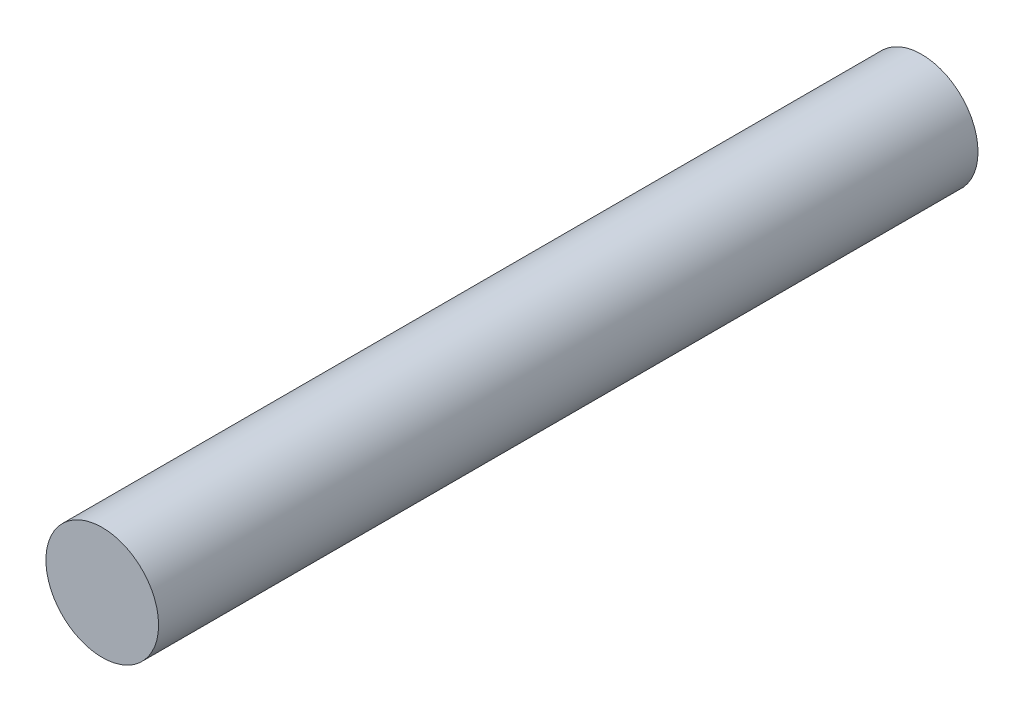
ISO-10303-21;
HEADER;
FILE_DESCRIPTION(('STEP AP214'),'2;1');
FILE_NAME('part.step','',(''),(''),'','','');
FILE_SCHEMA(('AUTOMOTIVE_DESIGN { 1 0 10303 214 1 1 1 1 }'));
ENDSEC;
DATA;
#1=APPLICATION_CONTEXT('core data for automotive mechanical design processes');
#2=APPLICATION_PROTOCOL_DEFINITION('international standard','automotive_design',2000,#1);
#3=PRODUCT_CONTEXT('',#1,'mechanical');
#4=PRODUCT('Part','Part','',(#3));
#5=PRODUCT_RELATED_PRODUCT_CATEGORY('part','',(#4));
#6=PRODUCT_DEFINITION_FORMATION('','',#4);
#7=PRODUCT_DEFINITION_CONTEXT('part definition',#1,'design');
#8=PRODUCT_DEFINITION('design','',#6,#7);
#9=PRODUCT_DEFINITION_SHAPE('','',#8);
#10=(LENGTH_UNIT() NAMED_UNIT(*) SI_UNIT(.MILLI.,.METRE.));
#11=(NAMED_UNIT(*) PLANE_ANGLE_UNIT() SI_UNIT($,.RADIAN.));
#12=(NAMED_UNIT(*) SI_UNIT($,.STERADIAN.) SOLID_ANGLE_UNIT());
#13=UNCERTAINTY_MEASURE_WITH_UNIT(LENGTH_MEASURE(1.E-05),#10,'distance_accuracy_value','');
#14=(GEOMETRIC_REPRESENTATION_CONTEXT(3) GLOBAL_UNCERTAINTY_ASSIGNED_CONTEXT((#13)) GLOBAL_UNIT_ASSIGNED_CONTEXT((#10,
#11,#12)) REPRESENTATION_CONTEXT('',''));
#15=CARTESIAN_POINT('',(0.,0.,0.));
#16=DIRECTION('',(0.,0.,1.));
#17=DIRECTION('',(1.,0.,0.));
#18=AXIS2_PLACEMENT_3D('',#15,#16,#17);
#19=CARTESIAN_POINT('',(0.,0.,58.18));
#20=DIRECTION('',(0.,0.,-1.));
#21=DIRECTION('',(-1.,0.,0.));
#22=AXIS2_PLACEMENT_3D('',#19,#20,#21);
#23=CYLINDRICAL_SURFACE('',#22,4.);
#24=CARTESIAN_POINT('',(0.,0.,58.18));
#25=DIRECTION('',(0.,0.,1.));
#26=DIRECTION('',(1.,0.,0.));
#27=AXIS2_PLACEMENT_3D('',#24,#25,#26);
#28=CIRCLE('',#27,4.);
#29=CARTESIAN_POINT('',(4.,0.,58.18));
#30=VERTEX_POINT('',#29);
#31=EDGE_CURVE('E10',#30,#30,#28,.T.);
#32=ORIENTED_EDGE('',*,*,#31,.F.);
#33=EDGE_LOOP('',(#32));
#34=FACE_BOUND('',#33,.T.);
#35=CARTESIAN_POINT('',(0.,0.,0.));
#36=DIRECTION('',(0.,0.,1.));
#37=DIRECTION('',(1.,0.,0.));
#38=AXIS2_PLACEMENT_3D('',#35,#36,#37);
#39=CIRCLE('',#38,4.);
#40=CARTESIAN_POINT('',(4.,0.,0.));
#41=VERTEX_POINT('',#40);
#42=EDGE_CURVE('E36',#41,#41,#39,.T.);
#43=ORIENTED_EDGE('',*,*,#42,.T.);
#44=EDGE_LOOP('',(#43));
#45=FACE_BOUND('',#44,.T.);
#46=ADVANCED_FACE('F33',(#34,#45),#23,.T.);
#47=CARTESIAN_POINT('',(0.,0.,58.18));
#48=DIRECTION('',(0.,0.,1.));
#49=DIRECTION('',(1.,0.,0.));
#50=AXIS2_PLACEMENT_3D('',#47,#48,#49);
#51=PLANE('',#50);
#52=ORIENTED_EDGE('',*,*,#31,.T.);
#53=EDGE_LOOP('',(#52));
#54=FACE_BOUND('',#53,.T.);
#55=ADVANCED_FACE('F48',(#54),#51,.T.);
#56=CARTESIAN_POINT('',(0.,0.,0.));
#57=DIRECTION('',(0.,0.,1.));
#58=DIRECTION('',(1.,0.,0.));
#59=AXIS2_PLACEMENT_3D('',#56,#57,#58);
#60=PLANE('',#59);
#61=ORIENTED_EDGE('',*,*,#42,.F.);
#62=EDGE_LOOP('',(#61));
#63=FACE_BOUND('',#62,.T.);
#64=ADVANCED_FACE('F46',(#63),#60,.F.);
#65=CLOSED_SHELL('',(#46,#55,#64));
#66=MANIFOLD_SOLID_BREP('B2',#65);
#67=ADVANCED_BREP_SHAPE_REPRESENTATION('',(#18,#66),#14);
#68=SHAPE_DEFINITION_REPRESENTATION(#9,#67);
ENDSEC;
END-ISO-10303-21;
